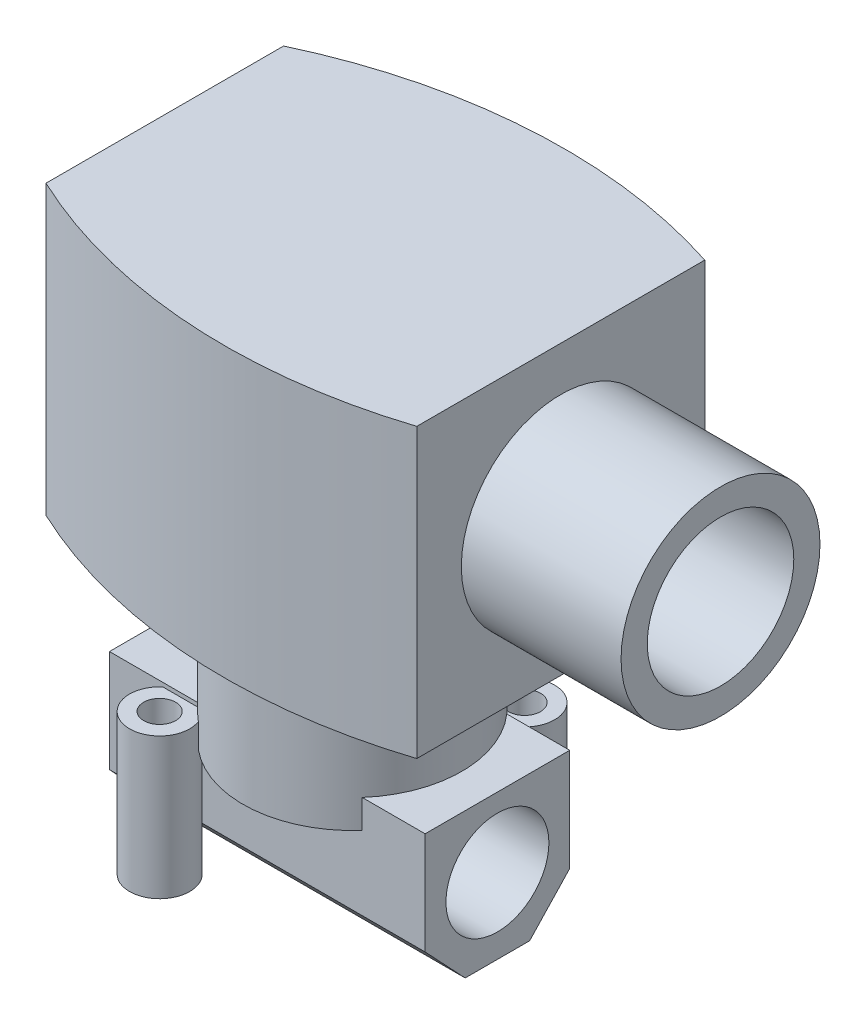
ISO-10303-21;
HEADER;
FILE_DESCRIPTION(('STEP AP214'),'2;1');
FILE_NAME('part.step','',(''),(''),'','','');
FILE_SCHEMA(('AUTOMOTIVE_DESIGN { 1 0 10303 214 1 1 1 1 }'));
ENDSEC;
DATA;
#1=APPLICATION_CONTEXT('core data for automotive mechanical design processes');
#2=APPLICATION_PROTOCOL_DEFINITION('international standard','automotive_design',2000,#1);
#3=PRODUCT_CONTEXT('',#1,'mechanical');
#4=PRODUCT('Part','Part','',(#3));
#5=PRODUCT_RELATED_PRODUCT_CATEGORY('part','',(#4));
#6=PRODUCT_DEFINITION_FORMATION('','',#4);
#7=PRODUCT_DEFINITION_CONTEXT('part definition',#1,'design');
#8=PRODUCT_DEFINITION('design','',#6,#7);
#9=PRODUCT_DEFINITION_SHAPE('','',#8);
#10=(LENGTH_UNIT() NAMED_UNIT(*) SI_UNIT(.MILLI.,.METRE.));
#11=(NAMED_UNIT(*) PLANE_ANGLE_UNIT() SI_UNIT($,.RADIAN.));
#12=(NAMED_UNIT(*) SI_UNIT($,.STERADIAN.) SOLID_ANGLE_UNIT());
#13=UNCERTAINTY_MEASURE_WITH_UNIT(LENGTH_MEASURE(1.E-05),#10,'distance_accuracy_value','');
#14=(GEOMETRIC_REPRESENTATION_CONTEXT(3) GLOBAL_UNCERTAINTY_ASSIGNED_CONTEXT((#13)) GLOBAL_UNIT_ASSIGNED_CONTEXT((#10,
#11,#12)) REPRESENTATION_CONTEXT('',''));
#15=CARTESIAN_POINT('',(0.,0.,0.));
#16=DIRECTION('',(0.,0.,1.));
#17=DIRECTION('',(1.,0.,0.));
#18=AXIS2_PLACEMENT_3D('',#15,#16,#17);
#19=CARTESIAN_POINT('',(-22.86,-53.08,-9.13));
#20=DIRECTION('',(0.,0.,-1.));
#21=DIRECTION('',(-1.,0.,0.));
#22=AXIS2_PLACEMENT_3D('',#19,#20,#21);
#23=PLANE('',#22);
#24=DIRECTION('',(0.,-1.,0.));
#25=VECTOR('',#24,1.);
#26=CARTESIAN_POINT('',(5.93096793082461,-53.58,-9.13000000000001));
#27=LINE('',#26,#25);
#28=CARTESIAN_POINT('',(5.93096793082461,-66.,-9.13000000000001));
#29=VERTEX_POINT('',#28);
#30=CARTESIAN_POINT('',(5.93096793082461,-56.68,-9.13000000000001));
#31=VERTEX_POINT('',#30);
#32=EDGE_CURVE('E366',#29,#31,#27,.F.);
#33=ORIENTED_EDGE('',*,*,#32,.F.);
#34=DIRECTION('',(1.,0.,0.));
#35=VECTOR('',#34,1.);
#36=CARTESIAN_POINT('',(-22.86,-66.,-9.13));
#37=LINE('',#36,#35);
#38=CARTESIAN_POINT('',(-22.86,-66.,-9.13));
#39=VERTEX_POINT('',#38);
#40=EDGE_CURVE('E288',#39,#29,#37,.T.);
#41=ORIENTED_EDGE('',*,*,#40,.F.);
#42=DIRECTION('',(0.,1.,0.));
#43=VECTOR('',#42,1.);
#44=CARTESIAN_POINT('',(-22.86,-53.08,-9.13));
#45=LINE('',#44,#43);
#46=CARTESIAN_POINT('',(-22.86,-53.08,-9.13));
#47=VERTEX_POINT('',#46);
#48=EDGE_CURVE('E307',#39,#47,#45,.T.);
#49=ORIENTED_EDGE('',*,*,#48,.T.);
#50=DIRECTION('',(1.,0.,0.));
#51=VECTOR('',#50,1.);
#52=CARTESIAN_POINT('',(-22.86,-53.08,-9.13));
#53=LINE('',#52,#51);
#54=CARTESIAN_POINT('',(-11.6830916759064,-53.08,-9.13));
#55=VERTEX_POINT('',#54);
#56=EDGE_CURVE('E292',#47,#55,#53,.T.);
#57=ORIENTED_EDGE('',*,*,#56,.T.);
#58=DIRECTION('',(0.,1.,0.));
#59=VECTOR('',#58,1.);
#60=CARTESIAN_POINT('',(-11.6830916759064,-56.68,-9.13));
#61=LINE('',#60,#59);
#62=CARTESIAN_POINT('',(-11.6830916759064,-56.68,-9.13));
#63=VERTEX_POINT('',#62);
#64=EDGE_CURVE('E275',#63,#55,#61,.T.);
#65=ORIENTED_EDGE('',*,*,#64,.F.);
#66=DIRECTION('',(1.,0.,0.));
#67=VECTOR('',#66,1.);
#68=CARTESIAN_POINT('',(-1.31500000000003,-56.68,-9.13000000000001));
#69=LINE('',#68,#67);
#70=EDGE_CURVE('E218',#63,#31,#69,.T.);
#71=ORIENTED_EDGE('',*,*,#70,.T.);
#72=EDGE_LOOP('',(#33,#41,#49,#57,#65,#71));
#73=FACE_BOUND('',#72,.T.);
#74=ADVANCED_FACE('F36',(#73),#23,.T.);
#75=CARTESIAN_POINT('',(-22.86,-66.,9.13));
#76=DIRECTION('',(0.,0.,1.));
#77=DIRECTION('',(1.,0.,0.));
#78=AXIS2_PLACEMENT_3D('',#75,#76,#77);
#79=PLANE('',#78);
#80=DIRECTION('',(0.,-1.,0.));
#81=VECTOR('',#80,1.);
#82=CARTESIAN_POINT('',(-11.1609679308246,-53.58,9.13));
#83=LINE('',#82,#81);
#84=CARTESIAN_POINT('',(-11.1609679308246,-66.,9.12999999999999));
#85=VERTEX_POINT('',#84);
#86=CARTESIAN_POINT('',(-11.1609679308246,-56.68,9.13));
#87=VERTEX_POINT('',#86);
#88=EDGE_CURVE('E345',#85,#87,#83,.F.);
#89=ORIENTED_EDGE('',*,*,#88,.F.);
#90=DIRECTION('',(1.,0.,0.));
#91=VECTOR('',#90,1.);
#92=CARTESIAN_POINT('',(-22.86,-66.,9.13));
#93=LINE('',#92,#91);
#94=CARTESIAN_POINT('',(16.999999966,-66.,9.12999999999999));
#95=VERTEX_POINT('',#94);
#96=EDGE_CURVE('E299',#85,#95,#93,.T.);
#97=ORIENTED_EDGE('',*,*,#96,.T.);
#98=DIRECTION('',(0.,-1.,0.));
#99=VECTOR('',#98,1.);
#100=CARTESIAN_POINT('',(16.999999966,-53.08,9.12999999999999));
#101=LINE('',#100,#99);
#102=CARTESIAN_POINT('',(16.999999966,-53.08,9.12999999999999));
#103=VERTEX_POINT('',#102);
#104=EDGE_CURVE('E330',#103,#95,#101,.T.);
#105=ORIENTED_EDGE('',*,*,#104,.F.);
#106=DIRECTION('',(1.,0.,0.));
#107=VECTOR('',#106,1.);
#108=CARTESIAN_POINT('',(-22.86,-53.08,9.13));
#109=LINE('',#108,#107);
#110=CARTESIAN_POINT('',(9.0530916759064,-53.08,9.12999999999999));
#111=VERTEX_POINT('',#110);
#112=EDGE_CURVE('E295',#111,#103,#109,.T.);
#113=ORIENTED_EDGE('',*,*,#112,.F.);
#114=DIRECTION('',(0.,1.,0.));
#115=VECTOR('',#114,1.);
#116=CARTESIAN_POINT('',(9.0530916759064,-56.68,9.12999999999999));
#117=LINE('',#116,#115);
#118=CARTESIAN_POINT('',(9.0530916759064,-56.68,9.12999999999999));
#119=VERTEX_POINT('',#118);
#120=EDGE_CURVE('E271',#119,#111,#117,.T.);
#121=ORIENTED_EDGE('',*,*,#120,.F.);
#122=DIRECTION('',(-1.,0.,0.));
#123=VECTOR('',#122,1.);
#124=CARTESIAN_POINT('',(-1.31500000000002,-56.68,9.12999999999999));
#125=LINE('',#124,#123);
#126=EDGE_CURVE('E215',#119,#87,#125,.T.);
#127=ORIENTED_EDGE('',*,*,#126,.T.);
#128=EDGE_LOOP('',(#89,#97,#105,#113,#121,#127));
#129=FACE_BOUND('',#128,.T.);
#130=ADVANCED_FACE('F403',(#129),#79,.T.);
#131=CARTESIAN_POINT('',(-22.86,-53.08,9.13));
#132=DIRECTION('',(0.,1.,0.));
#133=DIRECTION('',(0.,0.,1.));
#134=AXIS2_PLACEMENT_3D('',#131,#132,#133);
#135=PLANE('',#134);
#136=ORIENTED_EDGE('',*,*,#112,.T.);
#137=DIRECTION('',(0.,0.,1.));
#138=VECTOR('',#137,1.);
#139=CARTESIAN_POINT('',(16.999999966,-53.08,-9.13000000000001));
#140=LINE('',#139,#138);
#141=CARTESIAN_POINT('',(16.999999966,-53.08,-9.13000000000001));
#142=VERTEX_POINT('',#141);
#143=EDGE_CURVE('E319',#142,#103,#140,.T.);
#144=ORIENTED_EDGE('',*,*,#143,.F.);
#145=CARTESIAN_POINT('',(9.05309167590639,-53.08,-9.13000000000001));
#146=VERTEX_POINT('',#145);
#147=EDGE_CURVE('E291',#146,#142,#53,.T.);
#148=ORIENTED_EDGE('',*,*,#147,.F.);
#149=CARTESIAN_POINT('',(-1.31500000000002,-53.08,0.));
#150=DIRECTION('',(0.,1.,0.));
#151=DIRECTION('',(0.,0.,1.));
#152=AXIS2_PLACEMENT_3D('',#149,#150,#151);
#153=CIRCLE('',#152,13.815);
#154=EDGE_CURVE('E213',#111,#146,#153,.T.);
#155=ORIENTED_EDGE('',*,*,#154,.F.);
#156=EDGE_LOOP('',(#136,#144,#148,#155));
#157=FACE_BOUND('',#156,.T.);
#158=ADVANCED_FACE('F412',(#157),#135,.T.);
#159=DIRECTION('',(0.,-1.,0.));
#160=VECTOR('',#159,1.);
#161=CARTESIAN_POINT('',(-16.1190320691754,-53.58,9.13));
#162=LINE('',#161,#160);
#163=CARTESIAN_POINT('',(-16.1190320691754,-53.58,9.13));
#164=VERTEX_POINT('',#163);
#165=CARTESIAN_POINT('',(-16.1190320691754,-66.,9.13));
#166=VERTEX_POINT('',#165);
#167=EDGE_CURVE('E339',#164,#166,#162,.T.);
#168=ORIENTED_EDGE('',*,*,#167,.F.);
#169=DIRECTION('',(1.,0.,0.));
#170=VECTOR('',#169,1.);
#171=CARTESIAN_POINT('',(-22.86,-53.58,9.13));
#172=LINE('',#171,#170);
#173=CARTESIAN_POINT('',(-11.6830916759064,-53.58,9.13));
#174=VERTEX_POINT('',#173);
#175=EDGE_CURVE('E351',#164,#174,#172,.T.);
#176=ORIENTED_EDGE('',*,*,#175,.T.);
#177=DIRECTION('',(0.,1.,0.));
#178=VECTOR('',#177,1.);
#179=CARTESIAN_POINT('',(-11.6830916759064,-56.68,9.13));
#180=LINE('',#179,#178);
#181=CARTESIAN_POINT('',(-11.6830916759064,-53.08,9.13));
#182=VERTEX_POINT('',#181);
#183=EDGE_CURVE('E273',#182,#174,#180,.F.);
#184=ORIENTED_EDGE('',*,*,#183,.F.);
#185=CARTESIAN_POINT('',(-22.86,-53.08,9.13));
#186=VERTEX_POINT('',#185);
#187=EDGE_CURVE('E296',#186,#182,#109,.T.);
#188=ORIENTED_EDGE('',*,*,#187,.F.);
#189=DIRECTION('',(0.,-1.,0.));
#190=VECTOR('',#189,1.);
#191=CARTESIAN_POINT('',(-22.86,-66.,9.13));
#192=LINE('',#191,#190);
#193=CARTESIAN_POINT('',(-22.86,-66.,9.13));
#194=VERTEX_POINT('',#193);
#195=EDGE_CURVE('E284',#186,#194,#192,.T.);
#196=ORIENTED_EDGE('',*,*,#195,.T.);
#197=EDGE_CURVE('E279',#194,#166,#93,.T.);
#198=ORIENTED_EDGE('',*,*,#197,.T.);
#199=EDGE_LOOP('',(#168,#176,#184,#188,#196,#198));
#200=FACE_BOUND('',#199,.T.);
#201=ADVANCED_FACE('F415',(#200),#79,.T.);
#202=DIRECTION('',(0.,-1.,0.));
#203=VECTOR('',#202,1.);
#204=CARTESIAN_POINT('',(10.8890320691754,-53.58,-9.13000000000001));
#205=LINE('',#204,#203);
#206=CARTESIAN_POINT('',(10.8890320691754,-53.58,-9.13000000000001));
#207=VERTEX_POINT('',#206);
#208=CARTESIAN_POINT('',(10.8890320691754,-66.,-9.13000000000001));
#209=VERTEX_POINT('',#208);
#210=EDGE_CURVE('E58',#207,#209,#205,.T.);
#211=ORIENTED_EDGE('',*,*,#210,.F.);
#212=DIRECTION('',(-1.,0.,0.));
#213=VECTOR('',#212,1.);
#214=CARTESIAN_POINT('',(-22.86,-53.58,-9.13));
#215=LINE('',#214,#213);
#216=CARTESIAN_POINT('',(9.05309167590639,-53.58,-9.13000000000001));
#217=VERTEX_POINT('',#216);
#218=EDGE_CURVE('E358',#207,#217,#215,.T.);
#219=ORIENTED_EDGE('',*,*,#218,.T.);
#220=DIRECTION('',(0.,1.,0.));
#221=VECTOR('',#220,1.);
#222=CARTESIAN_POINT('',(9.05309167590639,-56.68,-9.13000000000001));
#223=LINE('',#222,#221);
#224=EDGE_CURVE('E277',#146,#217,#223,.F.);
#225=ORIENTED_EDGE('',*,*,#224,.F.);
#226=ORIENTED_EDGE('',*,*,#147,.T.);
#227=DIRECTION('',(0.,1.,0.));
#228=VECTOR('',#227,1.);
#229=CARTESIAN_POINT('',(16.999999966,-66.,-9.13000000000001));
#230=LINE('',#229,#228);
#231=CARTESIAN_POINT('',(16.999999966,-66.,-9.13000000000001));
#232=VERTEX_POINT('',#231);
#233=EDGE_CURVE('E321',#232,#142,#230,.T.);
#234=ORIENTED_EDGE('',*,*,#233,.F.);
#235=EDGE_CURVE('E287',#209,#232,#37,.T.);
#236=ORIENTED_EDGE('',*,*,#235,.F.);
#237=EDGE_LOOP('',(#211,#219,#225,#226,#234,#236));
#238=FACE_BOUND('',#237,.T.);
#239=ADVANCED_FACE('F406',(#238),#23,.T.);
#240=CARTESIAN_POINT('',(-22.86,-66.,9.13));
#241=DIRECTION('',(0.,-0.685111253048227,0.728438446916889));
#242=DIRECTION('',(0.,-0.728438446916889,-0.685111253048227));
#243=AXIS2_PLACEMENT_3D('',#240,#241,#242);
#244=PLANE('',#243);
#245=CARTESIAN_POINT('',(-13.64,-62.9378656126482,12.01));
#246=DIRECTION('',(0.,-0.685111253048227,0.728438446916889));
#247=DIRECTION('',(0.,-0.728438446916889,-0.685111253048227));
#248=AXIS2_PLACEMENT_3D('',#245,#246,#247);
#249=ELLIPSE('',#248,5.54654442339529,3.8);
#250=EDGE_CURVE('E342',#166,#85,#249,.T.);
#251=ORIENTED_EDGE('',*,*,#250,.F.);
#252=ORIENTED_EDGE('',*,*,#197,.F.);
#253=DIRECTION('',(0.,-0.728438446916889,-0.685111253048227));
#254=VECTOR('',#253,1.);
#255=CARTESIAN_POINT('',(-22.86,-66.,9.13));
#256=LINE('',#255,#254);
#257=CARTESIAN_POINT('',(-22.86,-71.38,4.07));
#258=VERTEX_POINT('',#257);
#259=EDGE_CURVE('E316',#194,#258,#256,.T.);
#260=ORIENTED_EDGE('',*,*,#259,.T.);
#261=DIRECTION('',(1.,0.,0.));
#262=VECTOR('',#261,1.);
#263=CARTESIAN_POINT('',(-22.86,-71.38,4.07));
#264=LINE('',#263,#262);
#265=CARTESIAN_POINT('',(16.999999966,-71.38,4.06999999999999));
#266=VERTEX_POINT('',#265);
#267=EDGE_CURVE('E280',#258,#266,#264,.T.);
#268=ORIENTED_EDGE('',*,*,#267,.T.);
#269=DIRECTION('',(0.,-0.728438446916889,-0.685111253048227));
#270=VECTOR('',#269,1.);
#271=CARTESIAN_POINT('',(16.999999966,-66.,9.12999999999999));
#272=LINE('',#271,#270);
#273=EDGE_CURVE('E328',#95,#266,#272,.T.);
#274=ORIENTED_EDGE('',*,*,#273,.F.);
#275=ORIENTED_EDGE('',*,*,#96,.F.);
#276=EDGE_LOOP('',(#251,#252,#260,#268,#274,#275));
#277=FACE_BOUND('',#276,.T.);
#278=ADVANCED_FACE('F418',(#277),#244,.T.);
#279=CARTESIAN_POINT('',(-22.86,-71.38,-4.07));
#280=DIRECTION('',(0.,-0.685111253048227,-0.728438446916889));
#281=DIRECTION('',(0.,0.728438446916889,-0.685111253048227));
#282=AXIS2_PLACEMENT_3D('',#279,#280,#281);
#283=PLANE('',#282);
#284=CARTESIAN_POINT('',(8.41000000000001,-62.9378656126482,-12.01));
#285=DIRECTION('',(0.,-0.685111253048227,-0.728438446916889));
#286=DIRECTION('',(0.,-0.728438446916889,0.685111253048227));
#287=AXIS2_PLACEMENT_3D('',#284,#285,#286);
#288=ELLIPSE('',#287,5.54654442339529,3.8);
#289=EDGE_CURVE('E363',#209,#29,#288,.T.);
#290=ORIENTED_EDGE('',*,*,#289,.F.);
#291=ORIENTED_EDGE('',*,*,#235,.T.);
#292=DIRECTION('',(0.,0.728438446916889,-0.685111253048227));
#293=VECTOR('',#292,1.);
#294=CARTESIAN_POINT('',(16.999999966,-71.38,-4.07000000000001));
#295=LINE('',#294,#293);
#296=CARTESIAN_POINT('',(16.999999966,-71.38,-4.07000000000001));
#297=VERTEX_POINT('',#296);
#298=EDGE_CURVE('E323',#297,#232,#295,.T.);
#299=ORIENTED_EDGE('',*,*,#298,.F.);
#300=DIRECTION('',(1.,0.,0.));
#301=VECTOR('',#300,1.);
#302=CARTESIAN_POINT('',(-22.86,-71.38,-4.07));
#303=LINE('',#302,#301);
#304=CARTESIAN_POINT('',(-22.86,-71.38,-4.07));
#305=VERTEX_POINT('',#304);
#306=EDGE_CURVE('E283',#305,#297,#303,.T.);
#307=ORIENTED_EDGE('',*,*,#306,.F.);
#308=DIRECTION('',(0.,0.728438446916889,-0.685111253048227));
#309=VECTOR('',#308,1.);
#310=CARTESIAN_POINT('',(-22.86,-71.38,-4.07));
#311=LINE('',#310,#309);
#312=EDGE_CURVE('E310',#305,#39,#311,.T.);
#313=ORIENTED_EDGE('',*,*,#312,.T.);
#314=ORIENTED_EDGE('',*,*,#40,.T.);
#315=EDGE_LOOP('',(#290,#291,#299,#307,#313,#314));
#316=FACE_BOUND('',#315,.T.);
#317=ADVANCED_FACE('F423',(#316),#283,.T.);
#318=CARTESIAN_POINT('',(-22.86,-71.38,4.07));
#319=DIRECTION('',(0.,-1.,0.));
#320=DIRECTION('',(0.,0.,-1.));
#321=AXIS2_PLACEMENT_3D('',#318,#319,#320);
#322=PLANE('',#321);
#323=ORIENTED_EDGE('',*,*,#306,.T.);
#324=DIRECTION('',(0.,0.,-1.));
#325=VECTOR('',#324,1.);
#326=CARTESIAN_POINT('',(16.999999966,-71.38,4.06999999999999));
#327=LINE('',#326,#325);
#328=EDGE_CURVE('E326',#266,#297,#327,.T.);
#329=ORIENTED_EDGE('',*,*,#328,.F.);
#330=ORIENTED_EDGE('',*,*,#267,.F.);
#331=DIRECTION('',(0.,0.,-1.));
#332=VECTOR('',#331,1.);
#333=CARTESIAN_POINT('',(-22.86,-71.38,4.07));
#334=LINE('',#333,#332);
#335=EDGE_CURVE('E313',#258,#305,#334,.T.);
#336=ORIENTED_EDGE('',*,*,#335,.T.);
#337=EDGE_LOOP('',(#323,#329,#330,#336));
#338=FACE_BOUND('',#337,.T.);
#339=ADVANCED_FACE('F462',(#338),#322,.T.);
#340=CARTESIAN_POINT('',(-1.31500000000002,-56.68,0.));
#341=DIRECTION('',(0.,-1.,0.));
#342=DIRECTION('',(0.,0.,-1.));
#343=AXIS2_PLACEMENT_3D('',#340,#341,#342);
#344=PLANE('',#343);
#345=CARTESIAN_POINT('',(-13.64,-56.68,12.01));
#346=DIRECTION('',(0.,-1.,0.));
#347=DIRECTION('',(0.,0.,-1.));
#348=AXIS2_PLACEMENT_3D('',#345,#346,#347);
#349=CIRCLE('',#348,3.8);
#350=CARTESIAN_POINT('',(-10.0813509230588,-56.68,10.677327216761));
#351=VERTEX_POINT('',#350);
#352=EDGE_CURVE('E348',#87,#351,#349,.T.);
#353=ORIENTED_EDGE('',*,*,#352,.F.);
#354=ORIENTED_EDGE('',*,*,#126,.F.);
#355=CARTESIAN_POINT('',(-1.31500000000002,-56.68,0.));
#356=DIRECTION('',(0.,-1.,0.));
#357=DIRECTION('',(0.,0.,-1.));
#358=AXIS2_PLACEMENT_3D('',#355,#356,#357);
#359=CIRCLE('',#358,13.815);
#360=EDGE_CURVE('E266',#119,#351,#359,.T.);
#361=ORIENTED_EDGE('',*,*,#360,.T.);
#362=EDGE_LOOP('',(#353,#354,#361));
#363=FACE_BOUND('',#362,.T.);
#364=ADVANCED_FACE('F447',(#363),#344,.T.);
#365=CARTESIAN_POINT('',(4.01236379007056,-36.33,-46.4974809759521));
#366=DIRECTION('',(0.,1.,0.));
#367=DIRECTION('',(0.,0.,1.));
#368=AXIS2_PLACEMENT_3D('',#365,#366,#367);
#369=CYLINDRICAL_SURFACE('',#368,67.9974809759523);
#370=CARTESIAN_POINT('',(4.01236379007056,0.,-46.4974809759521));
#371=DIRECTION('',(0.,1.,0.));
#372=DIRECTION('',(0.,0.,1.));
#373=AXIS2_PLACEMENT_3D('',#370,#371,#372);
#374=CIRCLE('',#373,67.9974809759523);
#375=CARTESIAN_POINT('',(-25.,0.,15.));
#376=VERTEX_POINT('',#375);
#377=CARTESIAN_POINT('',(25.,0.,18.18));
#378=VERTEX_POINT('',#377);
#379=EDGE_CURVE('E244',#376,#378,#374,.T.);
#380=ORIENTED_EDGE('',*,*,#379,.F.);
#381=DIRECTION('',(0.,1.,0.));
#382=VECTOR('',#381,1.);
#383=CARTESIAN_POINT('',(-25.,-36.33,15.));
#384=LINE('',#383,#382);
#385=CARTESIAN_POINT('',(-25.,-36.33,15.));
#386=VERTEX_POINT('',#385);
#387=EDGE_CURVE('E225',#386,#376,#384,.T.);
#388=ORIENTED_EDGE('',*,*,#387,.F.);
#389=CARTESIAN_POINT('',(4.01236379007056,-36.33,-46.4974809759521));
#390=DIRECTION('',(0.,1.,0.));
#391=DIRECTION('',(0.,0.,1.));
#392=AXIS2_PLACEMENT_3D('',#389,#390,#391);
#393=CIRCLE('',#392,67.9974809759523);
#394=CARTESIAN_POINT('',(25.,-36.33,18.18));
#395=VERTEX_POINT('',#394);
#396=EDGE_CURVE('E237',#386,#395,#393,.T.);
#397=ORIENTED_EDGE('',*,*,#396,.T.);
#398=DIRECTION('',(0.,1.,0.));
#399=VECTOR('',#398,1.);
#400=CARTESIAN_POINT('',(25.,-36.33,18.18));
#401=LINE('',#400,#399);
#402=EDGE_CURVE('E226',#395,#378,#401,.T.);
#403=ORIENTED_EDGE('',*,*,#402,.T.);
#404=EDGE_LOOP('',(#380,#388,#397,#403));
#405=FACE_BOUND('',#404,.T.);
#406=ADVANCED_FACE('F38',(#405),#369,.T.);
#407=CARTESIAN_POINT('',(-25.,-36.33,-15.));
#408=DIRECTION('',(-1.,0.,0.));
#409=DIRECTION('',(0.,0.,1.));
#410=AXIS2_PLACEMENT_3D('',#407,#408,#409);
#411=PLANE('',#410);
#412=DIRECTION('',(0.,0.,1.));
#413=VECTOR('',#412,1.);
#414=CARTESIAN_POINT('',(-25.,0.,-15.));
#415=LINE('',#414,#413);
#416=CARTESIAN_POINT('',(-25.,0.,-15.));
#417=VERTEX_POINT('',#416);
#418=EDGE_CURVE('E234',#417,#376,#415,.T.);
#419=ORIENTED_EDGE('',*,*,#418,.F.);
#420=DIRECTION('',(0.,1.,0.));
#421=VECTOR('',#420,1.);
#422=CARTESIAN_POINT('',(-25.,-36.33,-15.));
#423=LINE('',#422,#421);
#424=CARTESIAN_POINT('',(-25.,-36.33,-15.));
#425=VERTEX_POINT('',#424);
#426=EDGE_CURVE('E231',#425,#417,#423,.T.);
#427=ORIENTED_EDGE('',*,*,#426,.F.);
#428=DIRECTION('',(0.,0.,1.));
#429=VECTOR('',#428,1.);
#430=CARTESIAN_POINT('',(-25.,-36.33,-15.));
#431=LINE('',#430,#429);
#432=EDGE_CURVE('E229',#425,#386,#431,.T.);
#433=ORIENTED_EDGE('',*,*,#432,.T.);
#434=ORIENTED_EDGE('',*,*,#387,.T.);
#435=EDGE_LOOP('',(#419,#427,#433,#434));
#436=FACE_BOUND('',#435,.T.);
#437=ADVANCED_FACE('F745',(#436),#411,.T.);
#438=CARTESIAN_POINT('',(4.01236379007056,-36.33,46.4974809759521));
#439=DIRECTION('',(0.,1.,0.));
#440=DIRECTION('',(0.,0.,1.));
#441=AXIS2_PLACEMENT_3D('',#438,#439,#440);
#442=CYLINDRICAL_SURFACE('',#441,67.9974809759523);
#443=CARTESIAN_POINT('',(4.01236379007056,0.,46.4974809759521));
#444=DIRECTION('',(0.,1.,0.));
#445=DIRECTION('',(0.,0.,-1.));
#446=AXIS2_PLACEMENT_3D('',#443,#444,#445);
#447=CIRCLE('',#446,67.9974809759523);
#448=CARTESIAN_POINT('',(25.,0.,-18.18));
#449=VERTEX_POINT('',#448);
#450=EDGE_CURVE('E238',#449,#417,#447,.T.);
#451=ORIENTED_EDGE('',*,*,#450,.F.);
#452=DIRECTION('',(0.,1.,0.));
#453=VECTOR('',#452,1.);
#454=CARTESIAN_POINT('',(25.,-36.33,-18.18));
#455=LINE('',#454,#453);
#456=CARTESIAN_POINT('',(25.,-36.33,-18.18));
#457=VERTEX_POINT('',#456);
#458=EDGE_CURVE('E228',#457,#449,#455,.T.);
#459=ORIENTED_EDGE('',*,*,#458,.F.);
#460=CARTESIAN_POINT('',(4.01236379007056,-36.33,46.4974809759521));
#461=DIRECTION('',(0.,1.,0.));
#462=DIRECTION('',(0.,0.,-1.));
#463=AXIS2_PLACEMENT_3D('',#460,#461,#462);
#464=CIRCLE('',#463,67.9974809759523);
#465=EDGE_CURVE('E250',#457,#425,#464,.T.);
#466=ORIENTED_EDGE('',*,*,#465,.T.);
#467=ORIENTED_EDGE('',*,*,#426,.T.);
#468=EDGE_LOOP('',(#451,#459,#466,#467));
#469=FACE_BOUND('',#468,.T.);
#470=ADVANCED_FACE('F727',(#469),#442,.T.);
#471=CARTESIAN_POINT('',(25.,-36.33,-18.18));
#472=DIRECTION('',(1.,0.,0.));
#473=DIRECTION('',(0.,0.,-1.));
#474=AXIS2_PLACEMENT_3D('',#471,#472,#473);
#475=PLANE('',#474);
#476=CARTESIAN_POINT('',(25.,-18.165,0.));
#477=DIRECTION('',(1.,0.,0.));
#478=DIRECTION('',(0.,0.,-1.));
#479=AXIS2_PLACEMENT_3D('',#476,#477,#478);
#480=CIRCLE('',#479,12.56);
#481=CARTESIAN_POINT('',(25.,-18.165,-12.56));
#482=VERTEX_POINT('',#481);
#483=EDGE_CURVE('E258',#482,#482,#480,.T.);
#484=ORIENTED_EDGE('',*,*,#483,.F.);
#485=EDGE_LOOP('',(#484));
#486=FACE_BOUND('',#485,.T.);
#487=DIRECTION('',(0.,0.,-1.));
#488=VECTOR('',#487,1.);
#489=CARTESIAN_POINT('',(25.,0.,-18.18));
#490=LINE('',#489,#488);
#491=EDGE_CURVE('E241',#378,#449,#490,.T.);
#492=ORIENTED_EDGE('',*,*,#491,.F.);
#493=ORIENTED_EDGE('',*,*,#402,.F.);
#494=DIRECTION('',(0.,0.,-1.));
#495=VECTOR('',#494,1.);
#496=CARTESIAN_POINT('',(25.,-36.33,-18.18));
#497=LINE('',#496,#495);
#498=EDGE_CURVE('E253',#395,#457,#497,.T.);
#499=ORIENTED_EDGE('',*,*,#498,.T.);
#500=ORIENTED_EDGE('',*,*,#458,.T.);
#501=EDGE_LOOP('',(#492,#493,#499,#500));
#502=FACE_BOUND('',#501,.T.);
#503=ADVANCED_FACE('F677',(#486,#502),#475,.T.);
#504=CARTESIAN_POINT('',(4.01236379007056,-36.33,-46.4974809759521));
#505=DIRECTION('',(0.,1.,0.));
#506=DIRECTION('',(0.,0.,1.));
#507=AXIS2_PLACEMENT_3D('',#504,#505,#506);
#508=PLANE('',#507);
#509=CARTESIAN_POINT('',(-1.31500000000002,-36.33,0.));
#510=DIRECTION('',(0.,-1.,0.));
#511=DIRECTION('',(0.,0.,-1.));
#512=AXIS2_PLACEMENT_3D('',#509,#510,#511);
#513=CIRCLE('',#512,13.815);
#514=CARTESIAN_POINT('',(-1.31500000000002,-36.33,-13.815));
#515=VERTEX_POINT('',#514);
#516=EDGE_CURVE('E221',#515,#515,#513,.T.);
#517=ORIENTED_EDGE('',*,*,#516,.F.);
#518=EDGE_LOOP('',(#517));
#519=FACE_BOUND('',#518,.T.);
#520=ORIENTED_EDGE('',*,*,#396,.F.);
#521=ORIENTED_EDGE('',*,*,#432,.F.);
#522=ORIENTED_EDGE('',*,*,#465,.F.);
#523=ORIENTED_EDGE('',*,*,#498,.F.);
#524=EDGE_LOOP('',(#520,#521,#522,#523));
#525=FACE_BOUND('',#524,.T.);
#526=ADVANCED_FACE('F672',(#519,#525),#508,.F.);
#527=CARTESIAN_POINT('',(4.01236379007056,0.,-46.4974809759521));
#528=DIRECTION('',(0.,1.,0.));
#529=DIRECTION('',(0.,0.,1.));
#530=AXIS2_PLACEMENT_3D('',#527,#528,#529);
#531=PLANE('',#530);
#532=ORIENTED_EDGE('',*,*,#379,.T.);
#533=ORIENTED_EDGE('',*,*,#491,.T.);
#534=ORIENTED_EDGE('',*,*,#450,.T.);
#535=ORIENTED_EDGE('',*,*,#418,.T.);
#536=EDGE_LOOP('',(#532,#533,#534,#535));
#537=FACE_BOUND('',#536,.T.);
#538=ADVANCED_FACE('F676',(#537),#531,.T.);
#539=CARTESIAN_POINT('',(45.17,-18.165,0.));
#540=DIRECTION('',(1.,0.,0.));
#541=DIRECTION('',(0.,0.,-1.));
#542=AXIS2_PLACEMENT_3D('',#539,#540,#541);
#543=PLANE('',#542);
#544=CARTESIAN_POINT('',(45.17,-18.165,0.));
#545=DIRECTION('',(1.,0.,0.));
#546=DIRECTION('',(0.,0.,-1.));
#547=AXIS2_PLACEMENT_3D('',#544,#545,#546);
#548=CIRCLE('',#547,12.56);
#549=CARTESIAN_POINT('',(45.17,-18.165,-12.56));
#550=VERTEX_POINT('',#549);
#551=EDGE_CURVE('E247',#550,#550,#548,.T.);
#552=ORIENTED_EDGE('',*,*,#551,.T.);
#553=EDGE_LOOP('',(#552));
#554=FACE_BOUND('',#553,.T.);
#555=CARTESIAN_POINT('',(45.17,-18.165,0.));
#556=DIRECTION('',(1.,0.,0.));
#557=DIRECTION('',(0.,0.,-1.));
#558=AXIS2_PLACEMENT_3D('',#555,#556,#557);
#559=CIRCLE('',#558,9.25);
#560=CARTESIAN_POINT('',(45.17,-18.165,-9.25000000000001));
#561=VERTEX_POINT('',#560);
#562=EDGE_CURVE('E261',#561,#561,#559,.T.);
#563=ORIENTED_EDGE('',*,*,#562,.F.);
#564=EDGE_LOOP('',(#563));
#565=FACE_BOUND('',#564,.T.);
#566=ADVANCED_FACE('F709',(#554,#565),#543,.T.);
#567=CARTESIAN_POINT('',(45.17,-18.165,0.));
#568=DIRECTION('',(-1.,0.,0.));
#569=DIRECTION('',(0.,0.,1.));
#570=AXIS2_PLACEMENT_3D('',#567,#568,#569);
#571=CYLINDRICAL_SURFACE('',#570,12.56);
#572=ORIENTED_EDGE('',*,*,#551,.F.);
#573=EDGE_LOOP('',(#572));
#574=FACE_BOUND('',#573,.T.);
#575=ORIENTED_EDGE('',*,*,#483,.T.);
#576=EDGE_LOOP('',(#575));
#577=FACE_BOUND('',#576,.T.);
#578=ADVANCED_FACE('F698',(#574,#577),#571,.T.);
#579=CARTESIAN_POINT('',(45.17,-18.165,0.));
#580=DIRECTION('',(-1.,0.,0.));
#581=DIRECTION('',(0.,0.,1.));
#582=AXIS2_PLACEMENT_3D('',#579,#580,#581);
#583=CYLINDRICAL_SURFACE('',#582,9.25);
#584=ORIENTED_EDGE('',*,*,#562,.T.);
#585=EDGE_LOOP('',(#584));
#586=FACE_BOUND('',#585,.T.);
#587=CARTESIAN_POINT('',(25.,-18.165,0.));
#588=DIRECTION('',(1.,0.,0.));
#589=DIRECTION('',(0.,0.,-1.));
#590=AXIS2_PLACEMENT_3D('',#587,#588,#589);
#591=CIRCLE('',#590,9.25);
#592=CARTESIAN_POINT('',(25.,-18.165,-9.25));
#593=VERTEX_POINT('',#592);
#594=EDGE_CURVE('E222',#593,#593,#591,.F.);
#595=ORIENTED_EDGE('',*,*,#594,.T.);
#596=EDGE_LOOP('',(#595));
#597=FACE_BOUND('',#596,.T.);
#598=ADVANCED_FACE('F687',(#586,#597),#583,.F.);
#599=ORIENTED_EDGE('',*,*,#594,.F.);
#600=EDGE_LOOP('',(#599));
#601=FACE_BOUND('',#600,.T.);
#602=ADVANCED_FACE('F563',(#601),#475,.T.);
#603=CARTESIAN_POINT('',(-1.31500000000002,-56.68,0.));
#604=DIRECTION('',(0.,1.,0.));
#605=DIRECTION('',(0.,0.,1.));
#606=AXIS2_PLACEMENT_3D('',#603,#604,#605);
#607=CYLINDRICAL_SURFACE('',#606,13.815);
#608=CARTESIAN_POINT('',(-1.31500000000002,-53.58,0.));
#609=DIRECTION('',(0.,-1.,0.));
#610=DIRECTION('',(0.,0.,-1.));
#611=AXIS2_PLACEMENT_3D('',#608,#609,#610);
#612=CIRCLE('',#611,13.815);
#613=CARTESIAN_POINT('',(4.63755691404765,-53.58,-12.4668075779256));
#614=VERTEX_POINT('',#613);
#615=CARTESIAN_POINT('',(6.4840917353629,-53.58,-11.4029993029638));
#616=VERTEX_POINT('',#615);
#617=EDGE_CURVE('E44',#614,#616,#612,.T.);
#618=ORIENTED_EDGE('',*,*,#617,.F.);
#619=DIRECTION('',(0.,-1.,0.));
#620=VECTOR('',#619,1.);
#621=CARTESIAN_POINT('',(4.63755691404765,-62.48,-12.4668075779256));
#622=LINE('',#621,#620);
#623=CARTESIAN_POINT('',(4.63755691404765,-56.68,-12.4668075779256));
#624=VERTEX_POINT('',#623);
#625=EDGE_CURVE('E368',#614,#624,#622,.T.);
#626=ORIENTED_EDGE('',*,*,#625,.T.);
#627=EDGE_CURVE('E269',#63,#624,#359,.T.);
#628=ORIENTED_EDGE('',*,*,#627,.F.);
#629=ORIENTED_EDGE('',*,*,#64,.T.);
#630=EDGE_CURVE('E212',#55,#182,#153,.T.);
#631=ORIENTED_EDGE('',*,*,#630,.T.);
#632=ORIENTED_EDGE('',*,*,#183,.T.);
#633=CARTESIAN_POINT('',(-1.31500000000002,-53.58,0.));
#634=DIRECTION('',(0.,-1.,0.));
#635=DIRECTION('',(0.,0.,-1.));
#636=AXIS2_PLACEMENT_3D('',#633,#634,#635);
#637=CIRCLE('',#636,13.815);
#638=CARTESIAN_POINT('',(-10.0813509230588,-53.58,10.677327216761));
#639=VERTEX_POINT('',#638);
#640=EDGE_CURVE('E207',#639,#174,#637,.T.);
#641=ORIENTED_EDGE('',*,*,#640,.F.);
#642=DIRECTION('',(0.,-1.,0.));
#643=VECTOR('',#642,1.);
#644=CARTESIAN_POINT('',(-10.0813509230588,-62.48,10.677327216761));
#645=LINE('',#644,#643);
#646=EDGE_CURVE('E204',#639,#351,#645,.T.);
#647=ORIENTED_EDGE('',*,*,#646,.T.);
#648=ORIENTED_EDGE('',*,*,#360,.F.);
#649=ORIENTED_EDGE('',*,*,#120,.T.);
#650=ORIENTED_EDGE('',*,*,#154,.T.);
#651=ORIENTED_EDGE('',*,*,#224,.T.);
#652=CARTESIAN_POINT('',(8.21678491141047,-53.58,-9.99996507006936));
#653=VERTEX_POINT('',#652);
#654=EDGE_CURVE('E196',#653,#217,#612,.T.);
#655=ORIENTED_EDGE('',*,*,#654,.F.);
#656=EDGE_CURVE('E186',#616,#653,#612,.T.);
#657=ORIENTED_EDGE('',*,*,#656,.F.);
#658=EDGE_LOOP('',(#618,#626,#628,#629,#631,#632,#641,#647,#648,#649,#650,#651,#655,#657));
#659=FACE_BOUND('',#658,.T.);
#660=ORIENTED_EDGE('',*,*,#516,.T.);
#661=EDGE_LOOP('',(#660));
#662=FACE_BOUND('',#661,.T.);
#663=ADVANCED_FACE('F191',(#659,#662),#607,.T.);
#664=CARTESIAN_POINT('',(8.41000000000001,-56.68,-12.01));
#665=DIRECTION('',(0.,-1.,0.));
#666=DIRECTION('',(0.,0.,-1.));
#667=AXIS2_PLACEMENT_3D('',#664,#665,#666);
#668=CIRCLE('',#667,3.8);
#669=EDGE_CURVE('E202',#31,#624,#668,.T.);
#670=ORIENTED_EDGE('',*,*,#669,.F.);
#671=ORIENTED_EDGE('',*,*,#70,.F.);
#672=ORIENTED_EDGE('',*,*,#627,.T.);
#673=EDGE_LOOP('',(#670,#671,#672));
#674=FACE_BOUND('',#673,.T.);
#675=ADVANCED_FACE('F436',(#674),#344,.T.);
#676=ORIENTED_EDGE('',*,*,#630,.F.);
#677=ORIENTED_EDGE('',*,*,#56,.F.);
#678=DIRECTION('',(0.,0.,1.));
#679=VECTOR('',#678,1.);
#680=CARTESIAN_POINT('',(-22.86,-53.08,9.13));
#681=LINE('',#680,#679);
#682=EDGE_CURVE('E304',#47,#186,#681,.T.);
#683=ORIENTED_EDGE('',*,*,#682,.T.);
#684=ORIENTED_EDGE('',*,*,#187,.T.);
#685=EDGE_LOOP('',(#676,#677,#683,#684));
#686=FACE_BOUND('',#685,.T.);
#687=ADVANCED_FACE('F432',(#686),#135,.T.);
#688=CARTESIAN_POINT('',(-22.86,0.,0.));
#689=DIRECTION('',(1.,0.,0.));
#690=DIRECTION('',(0.,0.,-1.));
#691=AXIS2_PLACEMENT_3D('',#688,#689,#690);
#692=PLANE('',#691);
#693=CARTESIAN_POINT('',(-22.86,-61.8816710930904,0.));
#694=DIRECTION('',(1.,0.,0.));
#695=DIRECTION('',(0.,0.,-1.));
#696=AXIS2_PLACEMENT_3D('',#693,#694,#695);
#697=CIRCLE('',#696,6.5);
#698=CARTESIAN_POINT('',(-22.86,-61.8816710930904,-6.49999999999997));
#699=VERTEX_POINT('',#698);
#700=EDGE_CURVE('E333',#699,#699,#697,.T.);
#701=ORIENTED_EDGE('',*,*,#700,.T.);
#702=EDGE_LOOP('',(#701));
#703=FACE_BOUND('',#702,.T.);
#704=ORIENTED_EDGE('',*,*,#259,.F.);
#705=ORIENTED_EDGE('',*,*,#195,.F.);
#706=ORIENTED_EDGE('',*,*,#682,.F.);
#707=ORIENTED_EDGE('',*,*,#48,.F.);
#708=ORIENTED_EDGE('',*,*,#312,.F.);
#709=ORIENTED_EDGE('',*,*,#335,.F.);
#710=EDGE_LOOP('',(#704,#705,#706,#707,#708,#709));
#711=FACE_BOUND('',#710,.T.);
#712=ADVANCED_FACE('F434',(#703,#711),#692,.F.);
#713=CARTESIAN_POINT('',(16.999999966,0.,0.));
#714=DIRECTION('',(1.,0.,0.));
#715=DIRECTION('',(0.,0.,-1.));
#716=AXIS2_PLACEMENT_3D('',#713,#714,#715);
#717=PLANE('',#716);
#718=CARTESIAN_POINT('',(16.999999966,-61.8816710930904,0.));
#719=DIRECTION('',(1.,0.,0.));
#720=DIRECTION('',(0.,0.,-1.));
#721=AXIS2_PLACEMENT_3D('',#718,#719,#720);
#722=CIRCLE('',#721,6.5);
#723=CARTESIAN_POINT('',(16.999999966,-61.8816710930904,-6.50000000000001));
#724=VERTEX_POINT('',#723);
#725=EDGE_CURVE('E336',#724,#724,#722,.T.);
#726=ORIENTED_EDGE('',*,*,#725,.F.);
#727=EDGE_LOOP('',(#726));
#728=FACE_BOUND('',#727,.T.);
#729=ORIENTED_EDGE('',*,*,#104,.T.);
#730=ORIENTED_EDGE('',*,*,#273,.T.);
#731=ORIENTED_EDGE('',*,*,#328,.T.);
#732=ORIENTED_EDGE('',*,*,#298,.T.);
#733=ORIENTED_EDGE('',*,*,#233,.T.);
#734=ORIENTED_EDGE('',*,*,#143,.T.);
#735=EDGE_LOOP('',(#729,#730,#731,#732,#733,#734));
#736=FACE_BOUND('',#735,.T.);
#737=ADVANCED_FACE('F442',(#728,#736),#717,.T.);
#738=CARTESIAN_POINT('',(-25.,-61.8816710930904,0.));
#739=DIRECTION('',(1.,0.,0.));
#740=DIRECTION('',(0.,0.,-1.));
#741=AXIS2_PLACEMENT_3D('',#738,#739,#740);
#742=CYLINDRICAL_SURFACE('',#741,6.5);
#743=ORIENTED_EDGE('',*,*,#725,.T.);
#744=EDGE_LOOP('',(#743));
#745=FACE_BOUND('',#744,.T.);
#746=ORIENTED_EDGE('',*,*,#700,.F.);
#747=EDGE_LOOP('',(#746));
#748=FACE_BOUND('',#747,.T.);
#749=ADVANCED_FACE('F398',(#745,#748),#742,.F.);
#750=CARTESIAN_POINT('',(-13.64,-53.58,12.01));
#751=DIRECTION('',(0.,-1.,0.));
#752=DIRECTION('',(0.,0.,-1.));
#753=AXIS2_PLACEMENT_3D('',#750,#751,#752);
#754=PLANE('',#753);
#755=CARTESIAN_POINT('',(-13.64,-53.58,12.01));
#756=DIRECTION('',(0.,-1.,0.));
#757=DIRECTION('',(0.,0.,-1.));
#758=AXIS2_PLACEMENT_3D('',#755,#756,#757);
#759=CIRCLE('',#758,2.01929999999997);
#760=CARTESIAN_POINT('',(-13.64,-53.58,9.99070000000003));
#761=VERTEX_POINT('',#760);
#762=EDGE_CURVE('E375',#761,#761,#759,.T.);
#763=ORIENTED_EDGE('',*,*,#762,.T.);
#764=EDGE_LOOP('',(#763));
#765=FACE_BOUND('',#764,.T.);
#766=ORIENTED_EDGE('',*,*,#175,.F.);
#767=CARTESIAN_POINT('',(-13.64,-53.58,12.01));
#768=DIRECTION('',(0.,-1.,0.));
#769=DIRECTION('',(0.,0.,-1.));
#770=AXIS2_PLACEMENT_3D('',#767,#768,#769);
#771=CIRCLE('',#770,3.8);
#772=EDGE_CURVE('E354',#639,#164,#771,.T.);
#773=ORIENTED_EDGE('',*,*,#772,.F.);
#774=ORIENTED_EDGE('',*,*,#640,.T.);
#775=EDGE_LOOP('',(#766,#773,#774));
#776=FACE_BOUND('',#775,.T.);
#777=ADVANCED_FACE('F392',(#765,#776),#754,.F.);
#778=CARTESIAN_POINT('',(-13.64,-53.58,12.01));
#779=DIRECTION('',(0.,-1.,0.));
#780=DIRECTION('',(0.,0.,-1.));
#781=AXIS2_PLACEMENT_3D('',#778,#779,#780);
#782=CYLINDRICAL_SURFACE('',#781,3.8);
#783=ORIENTED_EDGE('',*,*,#772,.T.);
#784=ORIENTED_EDGE('',*,*,#167,.T.);
#785=ORIENTED_EDGE('',*,*,#250,.T.);
#786=ORIENTED_EDGE('',*,*,#88,.T.);
#787=ORIENTED_EDGE('',*,*,#352,.T.);
#788=ORIENTED_EDGE('',*,*,#646,.F.);
#789=EDGE_LOOP('',(#783,#784,#785,#786,#787,#788));
#790=FACE_BOUND('',#789,.T.);
#791=CARTESIAN_POINT('',(-13.64,-71.38,12.01));
#792=DIRECTION('',(0.,-1.,0.));
#793=DIRECTION('',(0.,0.,-1.));
#794=AXIS2_PLACEMENT_3D('',#791,#792,#793);
#795=CIRCLE('',#794,3.8);
#796=CARTESIAN_POINT('',(-13.64,-71.38,8.21));
#797=VERTEX_POINT('',#796);
#798=EDGE_CURVE('E355',#797,#797,#795,.T.);
#799=ORIENTED_EDGE('',*,*,#798,.F.);
#800=EDGE_LOOP('',(#799));
#801=FACE_BOUND('',#800,.T.);
#802=ADVANCED_FACE('F387',(#790,#801),#782,.T.);
#803=CARTESIAN_POINT('',(-13.64,-71.38,12.01));
#804=DIRECTION('',(0.,-1.,0.));
#805=DIRECTION('',(0.,0.,-1.));
#806=AXIS2_PLACEMENT_3D('',#803,#804,#805);
#807=PLANE('',#806);
#808=CARTESIAN_POINT('',(-13.64,-71.38,12.01));
#809=DIRECTION('',(0.,-1.,0.));
#810=DIRECTION('',(0.,0.,-1.));
#811=AXIS2_PLACEMENT_3D('',#808,#809,#810);
#812=CIRCLE('',#811,2.01929999999995);
#813=CARTESIAN_POINT('',(-13.64,-71.38,9.99070000000005));
#814=VERTEX_POINT('',#813);
#815=EDGE_CURVE('E378',#814,#814,#812,.T.);
#816=ORIENTED_EDGE('',*,*,#815,.F.);
#817=EDGE_LOOP('',(#816));
#818=FACE_BOUND('',#817,.T.);
#819=ORIENTED_EDGE('',*,*,#798,.T.);
#820=EDGE_LOOP('',(#819));
#821=FACE_BOUND('',#820,.T.);
#822=ADVANCED_FACE('F384',(#818,#821),#807,.T.);
#823=CARTESIAN_POINT('',(8.41000000000001,-53.58,-12.01));
#824=DIRECTION('',(0.,-1.,0.));
#825=DIRECTION('',(0.,0.,-1.));
#826=AXIS2_PLACEMENT_3D('',#823,#824,#825);
#827=PLANE('',#826);
#828=ORIENTED_EDGE('',*,*,#617,.T.);
#829=CARTESIAN_POINT('',(8.41000000000001,-53.58,-12.01));
#830=DIRECTION('',(0.,-1.,0.));
#831=DIRECTION('',(0.,0.,-1.));
#832=AXIS2_PLACEMENT_3D('',#829,#830,#831);
#833=CIRCLE('',#832,2.01929999999997);
#834=EDGE_CURVE('E11',#616,#653,#833,.T.);
#835=ORIENTED_EDGE('',*,*,#834,.T.);
#836=ORIENTED_EDGE('',*,*,#654,.T.);
#837=ORIENTED_EDGE('',*,*,#218,.F.);
#838=CARTESIAN_POINT('',(8.41000000000001,-53.58,-12.01));
#839=DIRECTION('',(0.,-1.,0.));
#840=DIRECTION('',(0.,0.,-1.));
#841=AXIS2_PLACEMENT_3D('',#838,#839,#840);
#842=CIRCLE('',#841,3.8);
#843=EDGE_CURVE('E200',#614,#207,#842,.T.);
#844=ORIENTED_EDGE('',*,*,#843,.F.);
#845=EDGE_LOOP('',(#828,#835,#836,#837,#844));
#846=FACE_BOUND('',#845,.T.);
#847=ADVANCED_FACE('F198',(#846),#827,.F.);
#848=CARTESIAN_POINT('',(8.41000000000001,-53.58,-12.01));
#849=DIRECTION('',(0.,-1.,0.));
#850=DIRECTION('',(0.,0.,-1.));
#851=AXIS2_PLACEMENT_3D('',#848,#849,#850);
#852=CYLINDRICAL_SURFACE('',#851,3.8);
#853=ORIENTED_EDGE('',*,*,#843,.T.);
#854=ORIENTED_EDGE('',*,*,#210,.T.);
#855=ORIENTED_EDGE('',*,*,#289,.T.);
#856=ORIENTED_EDGE('',*,*,#32,.T.);
#857=ORIENTED_EDGE('',*,*,#669,.T.);
#858=ORIENTED_EDGE('',*,*,#625,.F.);
#859=EDGE_LOOP('',(#853,#854,#855,#856,#857,#858));
#860=FACE_BOUND('',#859,.T.);
#861=CARTESIAN_POINT('',(8.41000000000001,-71.38,-12.01));
#862=DIRECTION('',(0.,-1.,0.));
#863=DIRECTION('',(0.,0.,-1.));
#864=AXIS2_PLACEMENT_3D('',#861,#862,#863);
#865=CIRCLE('',#864,3.8);
#866=CARTESIAN_POINT('',(8.41000000000001,-71.38,-15.81));
#867=VERTEX_POINT('',#866);
#868=EDGE_CURVE('E187',#867,#867,#865,.T.);
#869=ORIENTED_EDGE('',*,*,#868,.F.);
#870=EDGE_LOOP('',(#869));
#871=FACE_BOUND('',#870,.T.);
#872=ADVANCED_FACE('F483',(#860,#871),#852,.T.);
#873=CARTESIAN_POINT('',(8.41000000000001,-71.38,-12.01));
#874=DIRECTION('',(0.,-1.,0.));
#875=DIRECTION('',(0.,0.,-1.));
#876=AXIS2_PLACEMENT_3D('',#873,#874,#875);
#877=PLANE('',#876);
#878=CARTESIAN_POINT('',(8.41000000000001,-71.38,-12.01));
#879=DIRECTION('',(0.,-1.,0.));
#880=DIRECTION('',(0.,0.,-1.));
#881=AXIS2_PLACEMENT_3D('',#878,#879,#880);
#882=CIRCLE('',#881,2.01929999999995);
#883=CARTESIAN_POINT('',(8.41000000000001,-71.38,-14.0293));
#884=VERTEX_POINT('',#883);
#885=EDGE_CURVE('E188',#884,#884,#882,.T.);
#886=ORIENTED_EDGE('',*,*,#885,.F.);
#887=EDGE_LOOP('',(#886));
#888=FACE_BOUND('',#887,.T.);
#889=ORIENTED_EDGE('',*,*,#868,.T.);
#890=EDGE_LOOP('',(#889));
#891=FACE_BOUND('',#890,.T.);
#892=ADVANCED_FACE('F487',(#888,#891),#877,.T.);
#893=CARTESIAN_POINT('',(8.41000000000001,-53.58,-12.01));
#894=DIRECTION('',(0.,-1.,0.));
#895=DIRECTION('',(0.,0.,-1.));
#896=AXIS2_PLACEMENT_3D('',#893,#894,#895);
#897=PLANE('',#896);
#898=ORIENTED_EDGE('',*,*,#656,.T.);
#899=CARTESIAN_POINT('',(8.41000000000001,-53.58,-12.01));
#900=DIRECTION('',(0.,-1.,0.));
#901=DIRECTION('',(0.,0.,-1.));
#902=AXIS2_PLACEMENT_3D('',#899,#900,#901);
#903=CIRCLE('',#902,2.01929999999997);
#904=EDGE_CURVE('E50',#616,#653,#903,.F.);
#905=ORIENTED_EDGE('',*,*,#904,.F.);
#906=EDGE_LOOP('',(#898,#905));
#907=FACE_BOUND('',#906,.T.);
#908=ADVANCED_FACE('F185',(#907),#897,.T.);
#909=CARTESIAN_POINT('',(8.41000000000001,-71.38,-12.01));
#910=DIRECTION('',(0.,-1.,0.));
#911=DIRECTION('',(0.,0.,-1.));
#912=AXIS2_PLACEMENT_3D('',#909,#910,#911);
#913=CYLINDRICAL_SURFACE('',#912,2.01929999999997);
#914=ORIENTED_EDGE('',*,*,#904,.T.);
#915=ORIENTED_EDGE('',*,*,#834,.F.);
#916=EDGE_LOOP('',(#914,#915));
#917=FACE_BOUND('',#916,.T.);
#918=ORIENTED_EDGE('',*,*,#885,.T.);
#919=EDGE_LOOP('',(#918));
#920=FACE_BOUND('',#919,.T.);
#921=ADVANCED_FACE('F178',(#917,#920),#913,.F.);
#922=CARTESIAN_POINT('',(-13.64,-71.38,12.01));
#923=DIRECTION('',(0.,-1.,0.));
#924=DIRECTION('',(0.,0.,-1.));
#925=AXIS2_PLACEMENT_3D('',#922,#923,#924);
#926=CYLINDRICAL_SURFACE('',#925,2.01929999999997);
#927=ORIENTED_EDGE('',*,*,#762,.F.);
#928=EDGE_LOOP('',(#927));
#929=FACE_BOUND('',#928,.T.);
#930=ORIENTED_EDGE('',*,*,#815,.T.);
#931=EDGE_LOOP('',(#930));
#932=FACE_BOUND('',#931,.T.);
#933=ADVANCED_FACE('F382',(#929,#932),#926,.F.);
#934=CLOSED_SHELL('',(#74,#130,#158,#201,#239,#278,#317,#339,#364,#406,#437,#470,#503,#526,#538,
#566,#578,#598,#602,#663,#675,#687,#712,#737,#749,#777,#802,#822,#847,#872,#892,#908,#921,#933));
#935=MANIFOLD_SOLID_BREP('B2',#934);
#936=ADVANCED_BREP_SHAPE_REPRESENTATION('',(#18,#935),#14);
#937=SHAPE_DEFINITION_REPRESENTATION(#9,#936);
ENDSEC;
END-ISO-10303-21;
